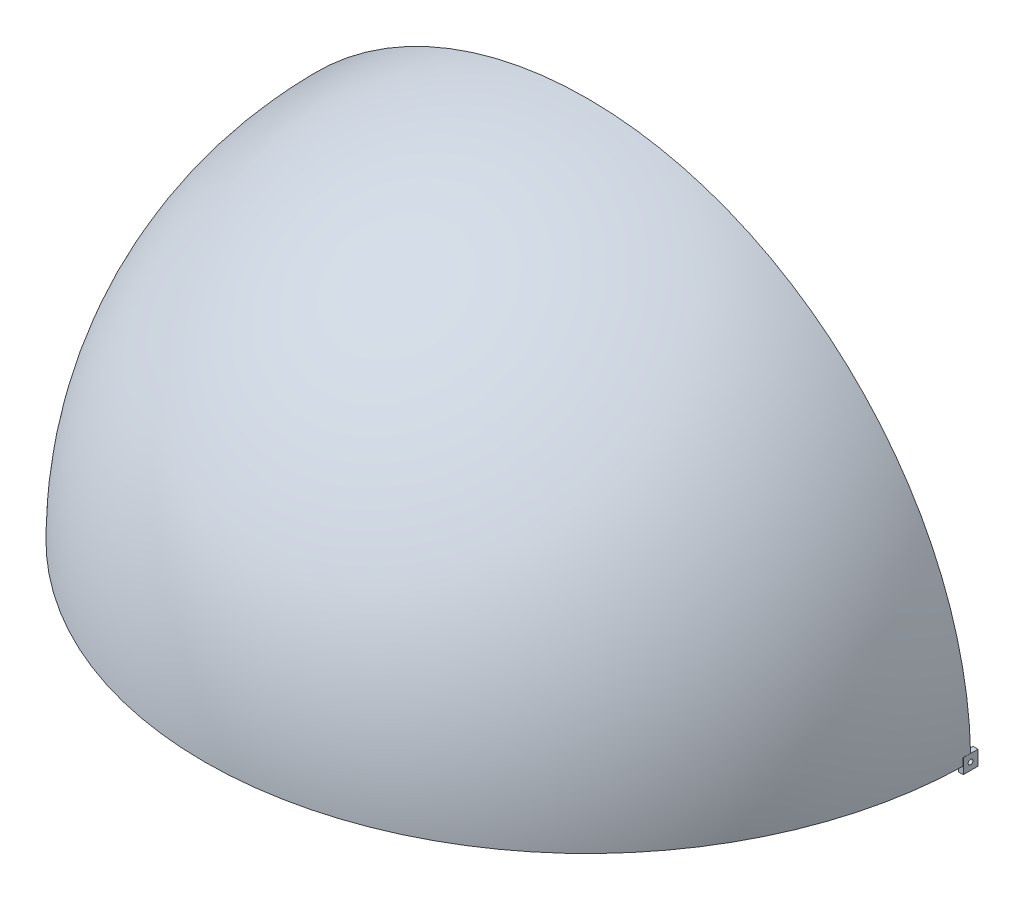
ISO-10303-21;
HEADER;
FILE_DESCRIPTION(('STEP AP214'),'2;1');
FILE_NAME('part.step','',(''),(''),'','','');
FILE_SCHEMA(('AUTOMOTIVE_DESIGN { 1 0 10303 214 1 1 1 1 }'));
ENDSEC;
DATA;
#1=APPLICATION_CONTEXT('core data for automotive mechanical design processes');
#2=APPLICATION_PROTOCOL_DEFINITION('international standard','automotive_design',2000,#1);
#3=PRODUCT_CONTEXT('',#1,'mechanical');
#4=PRODUCT('Part','Part','',(#3));
#5=PRODUCT_RELATED_PRODUCT_CATEGORY('part','',(#4));
#6=PRODUCT_DEFINITION_FORMATION('','',#4);
#7=PRODUCT_DEFINITION_CONTEXT('part definition',#1,'design');
#8=PRODUCT_DEFINITION('design','',#6,#7);
#9=PRODUCT_DEFINITION_SHAPE('','',#8);
#10=(LENGTH_UNIT() NAMED_UNIT(*) SI_UNIT(.MILLI.,.METRE.));
#11=(NAMED_UNIT(*) PLANE_ANGLE_UNIT() SI_UNIT($,.RADIAN.));
#12=(NAMED_UNIT(*) SI_UNIT($,.STERADIAN.) SOLID_ANGLE_UNIT());
#13=UNCERTAINTY_MEASURE_WITH_UNIT(LENGTH_MEASURE(1.E-05),#10,'distance_accuracy_value','');
#14=(GEOMETRIC_REPRESENTATION_CONTEXT(3) GLOBAL_UNCERTAINTY_ASSIGNED_CONTEXT((#13)) GLOBAL_UNIT_ASSIGNED_CONTEXT((#10,
#11,#12)) REPRESENTATION_CONTEXT('',''));
#15=CARTESIAN_POINT('',(0.,0.,0.));
#16=DIRECTION('',(0.,0.,1.));
#17=DIRECTION('',(1.,0.,0.));
#18=AXIS2_PLACEMENT_3D('',#15,#16,#17);
#19=CARTESIAN_POINT('',(154.,-5.37688126181843E-13,0.));
#20=DIRECTION('',(0.,0.,1.));
#21=DIRECTION('',(1.,0.,0.));
#22=AXIS2_PLACEMENT_3D('',#19,#20,#21);
#23=PLANE('',#22);
#24=CARTESIAN_POINT('',(0.,0.,0.));
#25=DIRECTION('',(0.,0.,1.));
#26=DIRECTION('',(1.,0.,0.));
#27=AXIS2_PLACEMENT_3D('',#24,#25,#26);
#28=CIRCLE('',#27,154.);
#29=CARTESIAN_POINT('',(153.996753212527,1.00000000000025,0.));
#30=VERTEX_POINT('',#29);
#31=CARTESIAN_POINT('',(-153.992694631921,1.5,0.));
#32=VERTEX_POINT('',#31);
#33=EDGE_CURVE('E336',#30,#32,#28,.T.);
#34=ORIENTED_EDGE('',*,*,#33,.T.);
#35=DIRECTION('',(-1.,0.,0.));
#36=VECTOR('',#35,1.);
#37=CARTESIAN_POINT('',(154.,1.5,0.));
#38=LINE('',#37,#36);
#39=CARTESIAN_POINT('',(-154.,1.5,0.));
#40=VERTEX_POINT('',#39);
#41=EDGE_CURVE('E214',#32,#40,#38,.T.);
#42=ORIENTED_EDGE('',*,*,#41,.T.);
#43=DIRECTION('',(0.,-1.,0.));
#44=VECTOR('',#43,1.);
#45=CARTESIAN_POINT('',(-154.,-5.37688126181843E-13,0.));
#46=LINE('',#45,#44);
#47=CARTESIAN_POINT('',(-154.,4.,0.));
#48=VERTEX_POINT('',#47);
#49=EDGE_CURVE('E261',#48,#40,#46,.T.);
#50=ORIENTED_EDGE('',*,*,#49,.F.);
#51=DIRECTION('',(-1.,0.,0.));
#52=VECTOR('',#51,1.);
#53=CARTESIAN_POINT('',(154.,4.,0.));
#54=LINE('',#53,#52);
#55=CARTESIAN_POINT('',(-155.948709516943,4.,0.));
#56=VERTEX_POINT('',#55);
#57=EDGE_CURVE('E266',#48,#56,#54,.T.);
#58=ORIENTED_EDGE('',*,*,#57,.T.);
#59=CARTESIAN_POINT('',(0.,0.,0.));
#60=DIRECTION('',(0.,0.,1.));
#61=DIRECTION('',(1.,0.,0.));
#62=AXIS2_PLACEMENT_3D('',#59,#60,#61);
#63=CIRCLE('',#62,156.);
#64=CARTESIAN_POINT('',(155.971151178672,2.99999999999946,0.));
#65=VERTEX_POINT('',#64);
#66=EDGE_CURVE('E333',#65,#56,#63,.T.);
#67=ORIENTED_EDGE('',*,*,#66,.F.);
#68=DIRECTION('',(1.,0.,0.));
#69=VECTOR('',#68,1.);
#70=CARTESIAN_POINT('',(156.,2.99999999999946,0.));
#71=LINE('',#70,#69);
#72=CARTESIAN_POINT('',(154.,2.99999999999946,0.));
#73=VERTEX_POINT('',#72);
#74=EDGE_CURVE('E309',#73,#65,#71,.T.);
#75=ORIENTED_EDGE('',*,*,#74,.F.);
#76=DIRECTION('',(0.,1.,0.));
#77=VECTOR('',#76,1.);
#78=CARTESIAN_POINT('',(154.,2.99999999999946,0.));
#79=LINE('',#78,#77);
#80=CARTESIAN_POINT('',(154.,1.,0.));
#81=VERTEX_POINT('',#80);
#82=EDGE_CURVE('E304',#81,#73,#79,.T.);
#83=ORIENTED_EDGE('',*,*,#82,.F.);
#84=DIRECTION('',(1.,0.,0.));
#85=VECTOR('',#84,1.);
#86=CARTESIAN_POINT('',(152.,1.,0.));
#87=LINE('',#86,#85);
#88=EDGE_CURVE('E281',#81,#30,#87,.F.);
#89=ORIENTED_EDGE('',*,*,#88,.T.);
#90=EDGE_LOOP('',(#34,#42,#50,#58,#67,#75,#83,#89));
#91=FACE_BOUND('',#90,.T.);
#92=ADVANCED_FACE('F39',(#91),#23,.F.);
#93=CARTESIAN_POINT('',(0.,0.,0.));
#94=DIRECTION('',(0.,0.,1.));
#95=DIRECTION('',(1.,0.,0.));
#96=AXIS2_PLACEMENT_3D('',#93,#94,#95);
#97=SPHERICAL_SURFACE('',#96,156.);
#98=CARTESIAN_POINT('',(0.,0.,3.98159451760361));
#99=DIRECTION('',(0.,0.,-1.));
#100=DIRECTION('',(-1.,0.,0.));
#101=AXIS2_PLACEMENT_3D('',#98,#99,#100);
#102=CIRCLE('',#101,155.949180520763);
#103=CARTESIAN_POINT('',(-155.949180520763,0.,3.98159451760361));
#104=VERTEX_POINT('',#103);
#105=CARTESIAN_POINT('',(-155.897873318071,4.,3.98159451760361));
#106=VERTEX_POINT('',#105);
#107=EDGE_CURVE('E264',#104,#106,#102,.T.);
#108=ORIENTED_EDGE('',*,*,#107,.F.);
#109=CARTESIAN_POINT('',(0.,0.,0.));
#110=DIRECTION('',(0.,-1.,0.));
#111=DIRECTION('',(0.,0.,-1.));
#112=AXIS2_PLACEMENT_3D('',#109,#110,#111);
#113=CIRCLE('',#112,156.);
#114=CARTESIAN_POINT('',(155.971151178672,-5.44570363738213E-13,3.));
#115=VERTEX_POINT('',#114);
#116=EDGE_CURVE('E330',#115,#104,#113,.T.);
#117=ORIENTED_EDGE('',*,*,#116,.F.);
#118=CARTESIAN_POINT('',(0.,0.,3.));
#119=DIRECTION('',(0.,0.,1.));
#120=DIRECTION('',(1.,0.,0.));
#121=AXIS2_PLACEMENT_3D('',#118,#119,#120);
#122=CIRCLE('',#121,155.971151178672);
#123=CARTESIAN_POINT('',(155.942297020404,2.99999999999946,3.));
#124=VERTEX_POINT('',#123);
#125=EDGE_CURVE('E301',#115,#124,#122,.T.);
#126=ORIENTED_EDGE('',*,*,#125,.T.);
#127=CARTESIAN_POINT('',(0.,2.99999999999946,0.));
#128=DIRECTION('',(0.,1.,0.));
#129=DIRECTION('',(0.,0.,1.));
#130=AXIS2_PLACEMENT_3D('',#127,#128,#129);
#131=CIRCLE('',#130,155.971151178672);
#132=EDGE_CURVE('E299',#124,#65,#131,.T.);
#133=ORIENTED_EDGE('',*,*,#132,.T.);
#134=ORIENTED_EDGE('',*,*,#66,.T.);
#135=CARTESIAN_POINT('',(0.,4.,0.));
#136=DIRECTION('',(0.,1.,0.));
#137=DIRECTION('',(0.,0.,1.));
#138=AXIS2_PLACEMENT_3D('',#135,#136,#137);
#139=CIRCLE('',#138,155.948709516943);
#140=EDGE_CURVE('E11',#56,#106,#139,.T.);
#141=ORIENTED_EDGE('',*,*,#140,.T.);
#142=EDGE_LOOP('',(#108,#117,#126,#133,#134,#141));
#143=FACE_BOUND('',#142,.T.);
#144=ADVANCED_FACE('F372',(#143),#97,.T.);
#145=CARTESIAN_POINT('',(0.,0.,0.));
#146=DIRECTION('',(0.,0.,1.));
#147=DIRECTION('',(-1.,0.,0.));
#148=AXIS2_PLACEMENT_3D('',#145,#146,#147);
#149=SPHERICAL_SURFACE('',#148,154.);
#150=CARTESIAN_POINT('',(-153.979706455104,0.,0.));
#151=DIRECTION('',(1.,0.,0.));
#152=DIRECTION('',(0.,0.,-1.));
#153=AXIS2_PLACEMENT_3D('',#150,#151,#152);
#154=CIRCLE('',#153,2.5);
#155=CARTESIAN_POINT('',(-153.979706455104,0.,2.5));
#156=VERTEX_POINT('',#155);
#157=CARTESIAN_POINT('',(-153.979706455104,1.5,2.));
#158=VERTEX_POINT('',#157);
#159=EDGE_CURVE('E208',#156,#158,#154,.F.);
#160=ORIENTED_EDGE('',*,*,#159,.T.);
#161=CARTESIAN_POINT('',(0.,1.5,0.));
#162=DIRECTION('',(0.,1.,0.));
#163=DIRECTION('',(0.,0.,1.));
#164=AXIS2_PLACEMENT_3D('',#161,#162,#163);
#165=CIRCLE('',#164,153.992694631921);
#166=EDGE_CURVE('E217',#158,#32,#165,.F.);
#167=ORIENTED_EDGE('',*,*,#166,.T.);
#168=ORIENTED_EDGE('',*,*,#33,.F.);
#169=CARTESIAN_POINT('',(153.996753212527,0.,0.));
#170=DIRECTION('',(-1.,0.,0.));
#171=DIRECTION('',(0.,0.,1.));
#172=AXIS2_PLACEMENT_3D('',#169,#170,#171);
#173=CIRCLE('',#172,1.);
#174=CARTESIAN_POINT('',(153.996753212527,0.,1.));
#175=VERTEX_POINT('',#174);
#176=EDGE_CURVE('E278',#30,#175,#173,.F.);
#177=ORIENTED_EDGE('',*,*,#176,.T.);
#178=CARTESIAN_POINT('',(0.,0.,0.));
#179=DIRECTION('',(0.,1.,0.));
#180=DIRECTION('',(0.,0.,-1.));
#181=AXIS2_PLACEMENT_3D('',#178,#179,#180);
#182=CIRCLE('',#181,154.);
#183=EDGE_CURVE('E328',#156,#175,#182,.T.);
#184=ORIENTED_EDGE('',*,*,#183,.F.);
#185=EDGE_LOOP('',(#160,#167,#168,#177,#184));
#186=FACE_BOUND('',#185,.T.);
#187=ADVANCED_FACE('F359',(#186),#149,.F.);
#188=CARTESIAN_POINT('',(0.,0.,0.));
#189=DIRECTION('',(0.,-1.,0.));
#190=DIRECTION('',(0.,0.,-1.));
#191=AXIS2_PLACEMENT_3D('',#188,#189,#190);
#192=PLANE('',#191);
#193=DIRECTION('',(-1.,0.,0.));
#194=VECTOR('',#193,1.);
#195=CARTESIAN_POINT('',(-152.,5.30705163504156E-13,2.5));
#196=LINE('',#195,#194);
#197=CARTESIAN_POINT('',(-154.,0.,2.5));
#198=VERTEX_POINT('',#197);
#199=EDGE_CURVE('E206',#156,#198,#196,.T.);
#200=ORIENTED_EDGE('',*,*,#199,.F.);
#201=ORIENTED_EDGE('',*,*,#183,.T.);
#202=DIRECTION('',(1.,0.,0.));
#203=VECTOR('',#202,1.);
#204=CARTESIAN_POINT('',(152.,-5.30705163504156E-13,1.));
#205=LINE('',#204,#203);
#206=CARTESIAN_POINT('',(154.,-5.37688126181843E-13,1.));
#207=VERTEX_POINT('',#206);
#208=EDGE_CURVE('E275',#207,#175,#205,.F.);
#209=ORIENTED_EDGE('',*,*,#208,.F.);
#210=DIRECTION('',(0.,0.,-1.));
#211=VECTOR('',#210,1.);
#212=CARTESIAN_POINT('',(154.,-5.37688126181843E-13,0.));
#213=LINE('',#212,#211);
#214=CARTESIAN_POINT('',(154.,-5.41179607520686E-13,3.));
#215=VERTEX_POINT('',#214);
#216=EDGE_CURVE('E296',#215,#207,#213,.T.);
#217=ORIENTED_EDGE('',*,*,#216,.F.);
#218=DIRECTION('',(-1.,0.,0.));
#219=VECTOR('',#218,1.);
#220=CARTESIAN_POINT('',(0.,0.,3.));
#221=LINE('',#220,#219);
#222=EDGE_CURVE('E46',#115,#215,#221,.T.);
#223=ORIENTED_EDGE('',*,*,#222,.F.);
#224=ORIENTED_EDGE('',*,*,#116,.T.);
#225=DIRECTION('',(1.,0.,0.));
#226=VECTOR('',#225,1.);
#227=CARTESIAN_POINT('',(-156.,0.,3.98159451760361));
#228=LINE('',#227,#226);
#229=CARTESIAN_POINT('',(-154.,0.,3.98159451760361));
#230=VERTEX_POINT('',#229);
#231=EDGE_CURVE('E223',#104,#230,#228,.T.);
#232=ORIENTED_EDGE('',*,*,#231,.T.);
#233=DIRECTION('',(0.,0.,-1.));
#234=VECTOR('',#233,1.);
#235=CARTESIAN_POINT('',(-154.,0.,0.));
#236=LINE('',#235,#234);
#237=EDGE_CURVE('E228',#230,#198,#236,.T.);
#238=ORIENTED_EDGE('',*,*,#237,.T.);
#239=EDGE_LOOP('',(#200,#201,#209,#217,#223,#224,#232,#238));
#240=FACE_BOUND('',#239,.T.);
#241=ADVANCED_FACE('F353',(#240),#192,.T.);
#242=CARTESIAN_POINT('',(154.,-3.00000000000054,-3.));
#243=DIRECTION('',(0.,1.,0.));
#244=DIRECTION('',(0.,0.,1.));
#245=AXIS2_PLACEMENT_3D('',#242,#243,#244);
#246=PLANE('',#245);
#247=DIRECTION('',(0.,0.,1.));
#248=VECTOR('',#247,1.);
#249=CARTESIAN_POINT('',(156.,-3.00000000000054,-3.));
#250=LINE('',#249,#248);
#251=CARTESIAN_POINT('',(156.,-3.00000000000054,-3.));
#252=VERTEX_POINT('',#251);
#253=CARTESIAN_POINT('',(156.,-3.00000000000054,3.));
#254=VERTEX_POINT('',#253);
#255=EDGE_CURVE('E326',#252,#254,#250,.T.);
#256=ORIENTED_EDGE('',*,*,#255,.T.);
#257=DIRECTION('',(-1.,0.,0.));
#258=VECTOR('',#257,1.);
#259=CARTESIAN_POINT('',(154.,-3.00000000000054,3.));
#260=LINE('',#259,#258);
#261=CARTESIAN_POINT('',(154.,-3.00000000000054,3.));
#262=VERTEX_POINT('',#261);
#263=EDGE_CURVE('E287',#254,#262,#260,.T.);
#264=ORIENTED_EDGE('',*,*,#263,.T.);
#265=DIRECTION('',(0.,0.,1.));
#266=VECTOR('',#265,1.);
#267=CARTESIAN_POINT('',(154.,-3.00000000000054,-3.));
#268=LINE('',#267,#266);
#269=CARTESIAN_POINT('',(154.,-3.00000000000054,-3.));
#270=VERTEX_POINT('',#269);
#271=EDGE_CURVE('E324',#270,#262,#268,.T.);
#272=ORIENTED_EDGE('',*,*,#271,.F.);
#273=DIRECTION('',(-1.,0.,0.));
#274=VECTOR('',#273,1.);
#275=CARTESIAN_POINT('',(154.,-3.00000000000054,-3.));
#276=LINE('',#275,#274);
#277=EDGE_CURVE('E308',#252,#270,#276,.T.);
#278=ORIENTED_EDGE('',*,*,#277,.F.);
#279=EDGE_LOOP('',(#256,#264,#272,#278));
#280=FACE_BOUND('',#279,.T.);
#281=ADVANCED_FACE('F380',(#280),#246,.F.);
#282=CARTESIAN_POINT('',(154.,2.99999999999946,-3.));
#283=DIRECTION('',(1.,0.,0.));
#284=DIRECTION('',(0.,0.,-1.));
#285=AXIS2_PLACEMENT_3D('',#282,#283,#284);
#286=PLANE('',#285);
#287=ORIENTED_EDGE('',*,*,#216,.T.);
#288=CARTESIAN_POINT('',(154.,0.,0.));
#289=DIRECTION('',(1.,0.,0.));
#290=DIRECTION('',(0.,0.,-1.));
#291=AXIS2_PLACEMENT_3D('',#288,#289,#290);
#292=CIRCLE('',#291,1.);
#293=EDGE_CURVE('E272',#207,#81,#292,.T.);
#294=ORIENTED_EDGE('',*,*,#293,.T.);
#295=ORIENTED_EDGE('',*,*,#82,.T.);
#296=DIRECTION('',(0.,0.,1.));
#297=VECTOR('',#296,1.);
#298=CARTESIAN_POINT('',(154.,2.99999999999946,-3.));
#299=LINE('',#298,#297);
#300=CARTESIAN_POINT('',(154.,2.99999999999946,-3.));
#301=VERTEX_POINT('',#300);
#302=EDGE_CURVE('E321',#301,#73,#299,.T.);
#303=ORIENTED_EDGE('',*,*,#302,.F.);
#304=DIRECTION('',(0.,1.,0.));
#305=VECTOR('',#304,1.);
#306=CARTESIAN_POINT('',(154.,-5.37688126181843E-13,-3.));
#307=LINE('',#306,#305);
#308=EDGE_CURVE('E311',#270,#301,#307,.T.);
#309=ORIENTED_EDGE('',*,*,#308,.F.);
#310=ORIENTED_EDGE('',*,*,#271,.T.);
#311=DIRECTION('',(0.,1.,0.));
#312=VECTOR('',#311,1.);
#313=CARTESIAN_POINT('',(154.,-5.37688126181843E-13,3.));
#314=LINE('',#313,#312);
#315=EDGE_CURVE('E290',#262,#215,#314,.T.);
#316=ORIENTED_EDGE('',*,*,#315,.T.);
#317=EDGE_LOOP('',(#287,#294,#295,#303,#309,#310,#316));
#318=FACE_BOUND('',#317,.T.);
#319=ADVANCED_FACE('F348',(#318),#286,.F.);
#320=CARTESIAN_POINT('',(156.,2.99999999999946,-3.));
#321=DIRECTION('',(0.,-1.,0.));
#322=DIRECTION('',(0.,0.,-1.));
#323=AXIS2_PLACEMENT_3D('',#320,#321,#322);
#324=PLANE('',#323);
#325=ORIENTED_EDGE('',*,*,#74,.T.);
#326=ORIENTED_EDGE('',*,*,#132,.F.);
#327=DIRECTION('',(1.,0.,0.));
#328=VECTOR('',#327,1.);
#329=CARTESIAN_POINT('',(156.,2.99999999999946,3.));
#330=LINE('',#329,#328);
#331=CARTESIAN_POINT('',(156.,2.99999999999946,3.));
#332=VERTEX_POINT('',#331);
#333=EDGE_CURVE('E293',#124,#332,#330,.T.);
#334=ORIENTED_EDGE('',*,*,#333,.T.);
#335=DIRECTION('',(0.,0.,1.));
#336=VECTOR('',#335,1.);
#337=CARTESIAN_POINT('',(156.,2.99999999999946,-3.));
#338=LINE('',#337,#336);
#339=CARTESIAN_POINT('',(156.,2.99999999999946,-3.));
#340=VERTEX_POINT('',#339);
#341=EDGE_CURVE('E316',#340,#332,#338,.T.);
#342=ORIENTED_EDGE('',*,*,#341,.F.);
#343=DIRECTION('',(1.,0.,0.));
#344=VECTOR('',#343,1.);
#345=CARTESIAN_POINT('',(156.,2.99999999999946,-3.));
#346=LINE('',#345,#344);
#347=EDGE_CURVE('E313',#301,#340,#346,.T.);
#348=ORIENTED_EDGE('',*,*,#347,.F.);
#349=ORIENTED_EDGE('',*,*,#302,.T.);
#350=EDGE_LOOP('',(#325,#326,#334,#342,#348,#349));
#351=FACE_BOUND('',#350,.T.);
#352=ADVANCED_FACE('F367',(#351),#324,.F.);
#353=CARTESIAN_POINT('',(156.,-5.44671088859529E-13,-3.));
#354=DIRECTION('',(-1.,0.,0.));
#355=DIRECTION('',(0.,0.,1.));
#356=AXIS2_PLACEMENT_3D('',#353,#354,#355);
#357=PLANE('',#356);
#358=CARTESIAN_POINT('',(156.,0.,0.));
#359=DIRECTION('',(1.,0.,0.));
#360=DIRECTION('',(0.,0.,-1.));
#361=AXIS2_PLACEMENT_3D('',#358,#359,#360);
#362=CIRCLE('',#361,1.);
#363=CARTESIAN_POINT('',(156.,0.,-1.));
#364=VERTEX_POINT('',#363);
#365=EDGE_CURVE('E269',#364,#364,#362,.T.);
#366=ORIENTED_EDGE('',*,*,#365,.F.);
#367=EDGE_LOOP('',(#366));
#368=FACE_BOUND('',#367,.T.);
#369=ORIENTED_EDGE('',*,*,#341,.T.);
#370=DIRECTION('',(0.,-1.,0.));
#371=VECTOR('',#370,1.);
#372=CARTESIAN_POINT('',(156.,-3.00000000000054,3.));
#373=LINE('',#372,#371);
#374=EDGE_CURVE('E284',#332,#254,#373,.T.);
#375=ORIENTED_EDGE('',*,*,#374,.T.);
#376=ORIENTED_EDGE('',*,*,#255,.F.);
#377=DIRECTION('',(0.,-1.,0.));
#378=VECTOR('',#377,1.);
#379=CARTESIAN_POINT('',(156.,-3.00000000000054,-3.));
#380=LINE('',#379,#378);
#381=EDGE_CURVE('E305',#340,#252,#380,.T.);
#382=ORIENTED_EDGE('',*,*,#381,.F.);
#383=EDGE_LOOP('',(#369,#375,#376,#382));
#384=FACE_BOUND('',#383,.T.);
#385=ADVANCED_FACE('F376',(#368,#384),#357,.F.);
#386=CARTESIAN_POINT('',(0.,0.,-3.));
#387=DIRECTION('',(0.,0.,1.));
#388=DIRECTION('',(1.,0.,0.));
#389=AXIS2_PLACEMENT_3D('',#386,#387,#388);
#390=PLANE('',#389);
#391=ORIENTED_EDGE('',*,*,#381,.T.);
#392=ORIENTED_EDGE('',*,*,#277,.T.);
#393=ORIENTED_EDGE('',*,*,#308,.T.);
#394=ORIENTED_EDGE('',*,*,#347,.T.);
#395=EDGE_LOOP('',(#391,#392,#393,#394));
#396=FACE_BOUND('',#395,.T.);
#397=ADVANCED_FACE('F378',(#396),#390,.F.);
#398=CARTESIAN_POINT('',(0.,0.,3.));
#399=DIRECTION('',(0.,0.,1.));
#400=DIRECTION('',(1.,0.,0.));
#401=AXIS2_PLACEMENT_3D('',#398,#399,#400);
#402=PLANE('',#401);
#403=ORIENTED_EDGE('',*,*,#125,.F.);
#404=ORIENTED_EDGE('',*,*,#222,.T.);
#405=ORIENTED_EDGE('',*,*,#315,.F.);
#406=ORIENTED_EDGE('',*,*,#263,.F.);
#407=ORIENTED_EDGE('',*,*,#374,.F.);
#408=ORIENTED_EDGE('',*,*,#333,.F.);
#409=EDGE_LOOP('',(#403,#404,#405,#406,#407,#408));
#410=FACE_BOUND('',#409,.T.);
#411=ADVANCED_FACE('F341',(#410),#402,.T.);
#412=CARTESIAN_POINT('',(152.,0.,0.));
#413=DIRECTION('',(1.,0.,0.));
#414=DIRECTION('',(0.,0.,-1.));
#415=AXIS2_PLACEMENT_3D('',#412,#413,#414);
#416=CYLINDRICAL_SURFACE('',#415,1.);
#417=ORIENTED_EDGE('',*,*,#365,.T.);
#418=EDGE_LOOP('',(#417));
#419=FACE_BOUND('',#418,.T.);
#420=ORIENTED_EDGE('',*,*,#293,.F.);
#421=ORIENTED_EDGE('',*,*,#208,.T.);
#422=ORIENTED_EDGE('',*,*,#176,.F.);
#423=ORIENTED_EDGE('',*,*,#88,.F.);
#424=EDGE_LOOP('',(#420,#421,#422,#423));
#425=FACE_BOUND('',#424,.T.);
#426=ADVANCED_FACE('F356',(#419,#425),#416,.F.);
#427=CARTESIAN_POINT('',(-156.,4.,3.98159451760361));
#428=DIRECTION('',(0.,0.,-1.));
#429=DIRECTION('',(-1.,0.,0.));
#430=AXIS2_PLACEMENT_3D('',#427,#428,#429);
#431=PLANE('',#430);
#432=DIRECTION('',(0.,-1.,0.));
#433=VECTOR('',#432,1.);
#434=CARTESIAN_POINT('',(-156.,4.,3.98159451760361));
#435=LINE('',#434,#433);
#436=CARTESIAN_POINT('',(-156.,4.,3.98159451760361));
#437=VERTEX_POINT('',#436);
#438=CARTESIAN_POINT('',(-156.,-4.,3.98159451760361));
#439=VERTEX_POINT('',#438);
#440=EDGE_CURVE('E259',#437,#439,#435,.T.);
#441=ORIENTED_EDGE('',*,*,#440,.T.);
#442=DIRECTION('',(1.,0.,0.));
#443=VECTOR('',#442,1.);
#444=CARTESIAN_POINT('',(-156.,-4.,3.98159451760361));
#445=LINE('',#444,#443);
#446=CARTESIAN_POINT('',(-154.,-4.,3.98159451760361));
#447=VERTEX_POINT('',#446);
#448=EDGE_CURVE('E227',#439,#447,#445,.T.);
#449=ORIENTED_EDGE('',*,*,#448,.T.);
#450=DIRECTION('',(0.,1.,0.));
#451=VECTOR('',#450,1.);
#452=CARTESIAN_POINT('',(-154.,-4.,3.98159451760361));
#453=LINE('',#452,#451);
#454=EDGE_CURVE('E237',#447,#230,#453,.T.);
#455=ORIENTED_EDGE('',*,*,#454,.T.);
#456=ORIENTED_EDGE('',*,*,#231,.F.);
#457=ORIENTED_EDGE('',*,*,#107,.T.);
#458=DIRECTION('',(1.,0.,0.));
#459=VECTOR('',#458,1.);
#460=CARTESIAN_POINT('',(-156.,4.,3.98159451760361));
#461=LINE('',#460,#459);
#462=EDGE_CURVE('E247',#437,#106,#461,.T.);
#463=ORIENTED_EDGE('',*,*,#462,.F.);
#464=EDGE_LOOP('',(#441,#449,#455,#456,#457,#463));
#465=FACE_BOUND('',#464,.T.);
#466=ADVANCED_FACE('F418',(#465),#431,.F.);
#467=CARTESIAN_POINT('',(-154.,4.,0.));
#468=DIRECTION('',(-1.,0.,0.));
#469=DIRECTION('',(0.,0.,1.));
#470=AXIS2_PLACEMENT_3D('',#467,#468,#469);
#471=PLANE('',#470);
#472=ORIENTED_EDGE('',*,*,#49,.T.);
#473=DIRECTION('',(0.,0.,-1.));
#474=VECTOR('',#473,1.);
#475=CARTESIAN_POINT('',(-154.,1.5,0.));
#476=LINE('',#475,#474);
#477=CARTESIAN_POINT('',(-154.,1.5,-2.));
#478=VERTEX_POINT('',#477);
#479=EDGE_CURVE('E211',#40,#478,#476,.T.);
#480=ORIENTED_EDGE('',*,*,#479,.T.);
#481=CARTESIAN_POINT('',(-154.,0.,0.));
#482=DIRECTION('',(-1.,0.,0.));
#483=DIRECTION('',(0.,0.,1.));
#484=AXIS2_PLACEMENT_3D('',#481,#482,#483);
#485=CIRCLE('',#484,2.5);
#486=CARTESIAN_POINT('',(-154.,-1.5,-2.));
#487=VERTEX_POINT('',#486);
#488=EDGE_CURVE('E220',#478,#487,#485,.T.);
#489=ORIENTED_EDGE('',*,*,#488,.T.);
#490=DIRECTION('',(0.,0.,1.));
#491=VECTOR('',#490,1.);
#492=CARTESIAN_POINT('',(-154.,-1.5,0.));
#493=LINE('',#492,#491);
#494=CARTESIAN_POINT('',(-154.,-1.5,2.));
#495=VERTEX_POINT('',#494);
#496=EDGE_CURVE('E201',#487,#495,#493,.T.);
#497=ORIENTED_EDGE('',*,*,#496,.T.);
#498=CARTESIAN_POINT('',(-154.,0.,0.));
#499=DIRECTION('',(-1.,0.,0.));
#500=DIRECTION('',(0.,0.,1.));
#501=AXIS2_PLACEMENT_3D('',#498,#499,#500);
#502=CIRCLE('',#501,2.5);
#503=EDGE_CURVE('E181',#495,#198,#502,.T.);
#504=ORIENTED_EDGE('',*,*,#503,.T.);
#505=ORIENTED_EDGE('',*,*,#237,.F.);
#506=ORIENTED_EDGE('',*,*,#454,.F.);
#507=DIRECTION('',(0.,0.,-1.));
#508=VECTOR('',#507,1.);
#509=CARTESIAN_POINT('',(-154.,-4.,0.));
#510=LINE('',#509,#508);
#511=CARTESIAN_POINT('',(-154.,-4.,-4.01840548239639));
#512=VERTEX_POINT('',#511);
#513=EDGE_CURVE('E231',#447,#512,#510,.T.);
#514=ORIENTED_EDGE('',*,*,#513,.T.);
#515=DIRECTION('',(0.,-1.,0.));
#516=VECTOR('',#515,1.);
#517=CARTESIAN_POINT('',(-154.,4.,-4.01840548239639));
#518=LINE('',#517,#516);
#519=CARTESIAN_POINT('',(-154.,4.,-4.01840548239639));
#520=VERTEX_POINT('',#519);
#521=EDGE_CURVE('E257',#520,#512,#518,.T.);
#522=ORIENTED_EDGE('',*,*,#521,.F.);
#523=DIRECTION('',(0.,0.,-1.));
#524=VECTOR('',#523,1.);
#525=CARTESIAN_POINT('',(-154.,4.,0.));
#526=LINE('',#525,#524);
#527=EDGE_CURVE('E250',#48,#520,#526,.T.);
#528=ORIENTED_EDGE('',*,*,#527,.F.);
#529=EDGE_LOOP('',(#472,#480,#489,#497,#504,#505,#506,#514,#522,#528));
#530=FACE_BOUND('',#529,.T.);
#531=ADVANCED_FACE('F412',(#530),#471,.F.);
#532=CARTESIAN_POINT('',(-156.,4.,-4.01840548239639));
#533=DIRECTION('',(0.,0.,1.));
#534=DIRECTION('',(1.,0.,0.));
#535=AXIS2_PLACEMENT_3D('',#532,#533,#534);
#536=PLANE('',#535);
#537=ORIENTED_EDGE('',*,*,#521,.T.);
#538=DIRECTION('',(-1.,0.,0.));
#539=VECTOR('',#538,1.);
#540=CARTESIAN_POINT('',(-156.,-4.,-4.01840548239639));
#541=LINE('',#540,#539);
#542=CARTESIAN_POINT('',(-156.,-4.,-4.01840548239639));
#543=VERTEX_POINT('',#542);
#544=EDGE_CURVE('E234',#512,#543,#541,.T.);
#545=ORIENTED_EDGE('',*,*,#544,.T.);
#546=DIRECTION('',(0.,-1.,0.));
#547=VECTOR('',#546,1.);
#548=CARTESIAN_POINT('',(-156.,4.,-4.01840548239639));
#549=LINE('',#548,#547);
#550=CARTESIAN_POINT('',(-156.,4.,-4.01840548239639));
#551=VERTEX_POINT('',#550);
#552=EDGE_CURVE('E255',#551,#543,#549,.T.);
#553=ORIENTED_EDGE('',*,*,#552,.F.);
#554=DIRECTION('',(-1.,0.,0.));
#555=VECTOR('',#554,1.);
#556=CARTESIAN_POINT('',(-156.,4.,-4.01840548239639));
#557=LINE('',#556,#555);
#558=EDGE_CURVE('E252',#520,#551,#557,.T.);
#559=ORIENTED_EDGE('',*,*,#558,.F.);
#560=EDGE_LOOP('',(#537,#545,#553,#559));
#561=FACE_BOUND('',#560,.T.);
#562=ADVANCED_FACE('F417',(#561),#536,.F.);
#563=CARTESIAN_POINT('',(-156.,4.,0.));
#564=DIRECTION('',(1.,0.,0.));
#565=DIRECTION('',(0.,0.,-1.));
#566=AXIS2_PLACEMENT_3D('',#563,#564,#565);
#567=PLANE('',#566);
#568=DIRECTION('',(0.,0.,1.));
#569=VECTOR('',#568,1.);
#570=CARTESIAN_POINT('',(-156.,-1.5,-2.));
#571=LINE('',#570,#569);
#572=CARTESIAN_POINT('',(-156.,-1.5,-2.));
#573=VERTEX_POINT('',#572);
#574=CARTESIAN_POINT('',(-156.,-1.5,2.));
#575=VERTEX_POINT('',#574);
#576=EDGE_CURVE('E187',#573,#575,#571,.T.);
#577=ORIENTED_EDGE('',*,*,#576,.F.);
#578=CARTESIAN_POINT('',(-156.,0.,0.));
#579=DIRECTION('',(-1.,0.,0.));
#580=DIRECTION('',(0.,0.,1.));
#581=AXIS2_PLACEMENT_3D('',#578,#579,#580);
#582=CIRCLE('',#581,2.5);
#583=CARTESIAN_POINT('',(-156.,1.5,-2.));
#584=VERTEX_POINT('',#583);
#585=EDGE_CURVE('E61',#584,#573,#582,.T.);
#586=ORIENTED_EDGE('',*,*,#585,.F.);
#587=DIRECTION('',(0.,0.,-1.));
#588=VECTOR('',#587,1.);
#589=CARTESIAN_POINT('',(-156.,1.5,-2.));
#590=LINE('',#589,#588);
#591=CARTESIAN_POINT('',(-156.,1.5,2.));
#592=VERTEX_POINT('',#591);
#593=EDGE_CURVE('E194',#592,#584,#590,.T.);
#594=ORIENTED_EDGE('',*,*,#593,.F.);
#595=CARTESIAN_POINT('',(-156.,0.,0.));
#596=DIRECTION('',(-1.,0.,0.));
#597=DIRECTION('',(0.,0.,1.));
#598=AXIS2_PLACEMENT_3D('',#595,#596,#597);
#599=CIRCLE('',#598,2.5);
#600=EDGE_CURVE('E178',#575,#592,#599,.T.);
#601=ORIENTED_EDGE('',*,*,#600,.F.);
#602=EDGE_LOOP('',(#577,#586,#594,#601));
#603=FACE_BOUND('',#602,.T.);
#604=ORIENTED_EDGE('',*,*,#552,.T.);
#605=DIRECTION('',(0.,0.,1.));
#606=VECTOR('',#605,1.);
#607=CARTESIAN_POINT('',(-156.,-4.,0.));
#608=LINE('',#607,#606);
#609=EDGE_CURVE('E224',#543,#439,#608,.T.);
#610=ORIENTED_EDGE('',*,*,#609,.T.);
#611=ORIENTED_EDGE('',*,*,#440,.F.);
#612=DIRECTION('',(0.,0.,1.));
#613=VECTOR('',#612,1.);
#614=CARTESIAN_POINT('',(-156.,4.,0.));
#615=LINE('',#614,#613);
#616=EDGE_CURVE('E244',#551,#437,#615,.T.);
#617=ORIENTED_EDGE('',*,*,#616,.F.);
#618=EDGE_LOOP('',(#604,#610,#611,#617));
#619=FACE_BOUND('',#618,.T.);
#620=ADVANCED_FACE('F191',(#603,#619),#567,.F.);
#621=CARTESIAN_POINT('',(0.,4.,0.));
#622=DIRECTION('',(0.,1.,0.));
#623=DIRECTION('',(0.,0.,1.));
#624=AXIS2_PLACEMENT_3D('',#621,#622,#623);
#625=PLANE('',#624);
#626=ORIENTED_EDGE('',*,*,#57,.F.);
#627=ORIENTED_EDGE('',*,*,#527,.T.);
#628=ORIENTED_EDGE('',*,*,#558,.T.);
#629=ORIENTED_EDGE('',*,*,#616,.T.);
#630=ORIENTED_EDGE('',*,*,#462,.T.);
#631=ORIENTED_EDGE('',*,*,#140,.F.);
#632=EDGE_LOOP('',(#626,#627,#628,#629,#630,#631));
#633=FACE_BOUND('',#632,.T.);
#634=ADVANCED_FACE('F432',(#633),#625,.T.);
#635=CARTESIAN_POINT('',(0.,-4.,0.));
#636=DIRECTION('',(0.,1.,0.));
#637=DIRECTION('',(0.,0.,1.));
#638=AXIS2_PLACEMENT_3D('',#635,#636,#637);
#639=PLANE('',#638);
#640=ORIENTED_EDGE('',*,*,#609,.F.);
#641=ORIENTED_EDGE('',*,*,#544,.F.);
#642=ORIENTED_EDGE('',*,*,#513,.F.);
#643=ORIENTED_EDGE('',*,*,#448,.F.);
#644=EDGE_LOOP('',(#640,#641,#642,#643));
#645=FACE_BOUND('',#644,.T.);
#646=ADVANCED_FACE('F446',(#645),#639,.F.);
#647=CARTESIAN_POINT('',(-152.,0.,0.));
#648=DIRECTION('',(-1.,0.,0.));
#649=DIRECTION('',(0.,0.,1.));
#650=AXIS2_PLACEMENT_3D('',#647,#648,#649);
#651=CYLINDRICAL_SURFACE('',#650,2.5);
#652=DIRECTION('',(-1.,0.,0.));
#653=VECTOR('',#652,1.);
#654=CARTESIAN_POINT('',(-152.,1.5,-2.));
#655=LINE('',#654,#653);
#656=EDGE_CURVE('E199',#478,#584,#655,.T.);
#657=ORIENTED_EDGE('',*,*,#656,.T.);
#658=ORIENTED_EDGE('',*,*,#585,.T.);
#659=DIRECTION('',(-1.,0.,0.));
#660=VECTOR('',#659,1.);
#661=CARTESIAN_POINT('',(-152.,-1.5,-2.));
#662=LINE('',#661,#660);
#663=EDGE_CURVE('E184',#487,#573,#662,.T.);
#664=ORIENTED_EDGE('',*,*,#663,.F.);
#665=ORIENTED_EDGE('',*,*,#488,.F.);
#666=EDGE_LOOP('',(#657,#658,#664,#665));
#667=FACE_BOUND('',#666,.T.);
#668=ADVANCED_FACE('F440',(#667),#651,.F.);
#669=CARTESIAN_POINT('',(-152.,1.5,-2.));
#670=DIRECTION('',(0.,1.,0.));
#671=DIRECTION('',(0.,0.,1.));
#672=AXIS2_PLACEMENT_3D('',#669,#670,#671);
#673=PLANE('',#672);
#674=DIRECTION('',(-1.,0.,0.));
#675=VECTOR('',#674,1.);
#676=CARTESIAN_POINT('',(-152.,1.5,2.));
#677=LINE('',#676,#675);
#678=EDGE_CURVE('E183',#158,#592,#677,.T.);
#679=ORIENTED_EDGE('',*,*,#678,.T.);
#680=ORIENTED_EDGE('',*,*,#593,.T.);
#681=ORIENTED_EDGE('',*,*,#656,.F.);
#682=ORIENTED_EDGE('',*,*,#479,.F.);
#683=ORIENTED_EDGE('',*,*,#41,.F.);
#684=ORIENTED_EDGE('',*,*,#166,.F.);
#685=EDGE_LOOP('',(#679,#680,#681,#682,#683,#684));
#686=FACE_BOUND('',#685,.T.);
#687=ADVANCED_FACE('F445',(#686),#673,.F.);
#688=CARTESIAN_POINT('',(-152.,0.,0.));
#689=DIRECTION('',(-1.,0.,0.));
#690=DIRECTION('',(0.,0.,1.));
#691=AXIS2_PLACEMENT_3D('',#688,#689,#690);
#692=CYLINDRICAL_SURFACE('',#691,2.5);
#693=ORIENTED_EDGE('',*,*,#199,.T.);
#694=ORIENTED_EDGE('',*,*,#503,.F.);
#695=DIRECTION('',(-1.,0.,0.));
#696=VECTOR('',#695,1.);
#697=CARTESIAN_POINT('',(-152.,-1.5,2.));
#698=LINE('',#697,#696);
#699=EDGE_CURVE('E53',#495,#575,#698,.T.);
#700=ORIENTED_EDGE('',*,*,#699,.T.);
#701=ORIENTED_EDGE('',*,*,#600,.T.);
#702=ORIENTED_EDGE('',*,*,#678,.F.);
#703=ORIENTED_EDGE('',*,*,#159,.F.);
#704=EDGE_LOOP('',(#693,#694,#700,#701,#702,#703));
#705=FACE_BOUND('',#704,.T.);
#706=ADVANCED_FACE('F175',(#705),#692,.F.);
#707=CARTESIAN_POINT('',(-152.,-1.5,-2.));
#708=DIRECTION('',(0.,-1.,0.));
#709=DIRECTION('',(0.,0.,-1.));
#710=AXIS2_PLACEMENT_3D('',#707,#708,#709);
#711=PLANE('',#710);
#712=ORIENTED_EDGE('',*,*,#663,.T.);
#713=ORIENTED_EDGE('',*,*,#576,.T.);
#714=ORIENTED_EDGE('',*,*,#699,.F.);
#715=ORIENTED_EDGE('',*,*,#496,.F.);
#716=EDGE_LOOP('',(#712,#713,#714,#715));
#717=FACE_BOUND('',#716,.T.);
#718=ADVANCED_FACE('F188',(#717),#711,.F.);
#719=CLOSED_SHELL('',(#92,#144,#187,#241,#281,#319,#352,#385,#397,#411,#426,#466,#531,#562,#620,
#634,#646,#668,#687,#706,#718));
#720=MANIFOLD_SOLID_BREP('B2',#719);
#721=ADVANCED_BREP_SHAPE_REPRESENTATION('',(#18,#720),#14);
#722=SHAPE_DEFINITION_REPRESENTATION(#9,#721);
ENDSEC;
END-ISO-10303-21;
